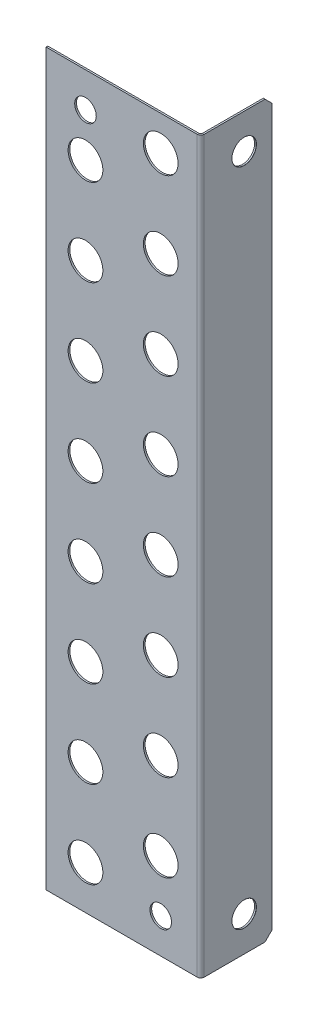
ISO-10303-21;
HEADER;
FILE_DESCRIPTION(('STEP AP214'),'2;1');
FILE_NAME('part.step','',(''),(''),'','','');
FILE_SCHEMA(('AUTOMOTIVE_DESIGN { 1 0 10303 214 1 1 1 1 }'));
ENDSEC;
DATA;
#1=APPLICATION_CONTEXT('core data for automotive mechanical design processes');
#2=APPLICATION_PROTOCOL_DEFINITION('international standard','automotive_design',2000,#1);
#3=PRODUCT_CONTEXT('',#1,'mechanical');
#4=PRODUCT('Part','Part','',(#3));
#5=PRODUCT_RELATED_PRODUCT_CATEGORY('part','',(#4));
#6=PRODUCT_DEFINITION_FORMATION('','',#4);
#7=PRODUCT_DEFINITION_CONTEXT('part definition',#1,'design');
#8=PRODUCT_DEFINITION('design','',#6,#7);
#9=PRODUCT_DEFINITION_SHAPE('','',#8);
#10=(LENGTH_UNIT() NAMED_UNIT(*) SI_UNIT(.MILLI.,.METRE.));
#11=(NAMED_UNIT(*) PLANE_ANGLE_UNIT() SI_UNIT($,.RADIAN.));
#12=(NAMED_UNIT(*) SI_UNIT($,.STERADIAN.) SOLID_ANGLE_UNIT());
#13=UNCERTAINTY_MEASURE_WITH_UNIT(LENGTH_MEASURE(1.E-05),#10,'distance_accuracy_value','');
#14=(GEOMETRIC_REPRESENTATION_CONTEXT(3) GLOBAL_UNCERTAINTY_ASSIGNED_CONTEXT((#13)) GLOBAL_UNIT_ASSIGNED_CONTEXT((#10,
#11,#12)) REPRESENTATION_CONTEXT('',''));
#15=CARTESIAN_POINT('',(0.,0.,0.));
#16=DIRECTION('',(0.,0.,1.));
#17=DIRECTION('',(1.,0.,0.));
#18=AXIS2_PLACEMENT_3D('',#15,#16,#17);
#19=CARTESIAN_POINT('',(-22.,105.,0.5));
#20=DIRECTION('',(0.,-1.,0.));
#21=DIRECTION('',(0.,0.,-1.));
#22=AXIS2_PLACEMENT_3D('',#19,#20,#21);
#23=PLANE('',#22);
#24=DIRECTION('',(0.,0.,1.));
#25=VECTOR('',#24,1.);
#26=CARTESIAN_POINT('',(21.5,105.,0.));
#27=LINE('',#26,#25);
#28=CARTESIAN_POINT('',(21.5,105.,0.));
#29=VERTEX_POINT('',#28);
#30=CARTESIAN_POINT('',(21.5,105.,0.5));
#31=VERTEX_POINT('',#30);
#32=EDGE_CURVE('E178',#29,#31,#27,.T.);
#33=ORIENTED_EDGE('',*,*,#32,.F.);
#34=DIRECTION('',(-1.,0.,0.));
#35=VECTOR('',#34,1.);
#36=CARTESIAN_POINT('',(-22.,105.,0.));
#37=LINE('',#36,#35);
#38=CARTESIAN_POINT('',(-22.,105.,0.));
#39=VERTEX_POINT('',#38);
#40=EDGE_CURVE('E197',#29,#39,#37,.T.);
#41=ORIENTED_EDGE('',*,*,#40,.T.);
#42=DIRECTION('',(0.,0.,-1.));
#43=VECTOR('',#42,1.);
#44=CARTESIAN_POINT('',(-22.,105.,0.5));
#45=LINE('',#44,#43);
#46=CARTESIAN_POINT('',(-22.,105.,0.5));
#47=VERTEX_POINT('',#46);
#48=EDGE_CURVE('E223',#47,#39,#45,.T.);
#49=ORIENTED_EDGE('',*,*,#48,.F.);
#50=DIRECTION('',(-1.,0.,0.));
#51=VECTOR('',#50,1.);
#52=CARTESIAN_POINT('',(-22.,105.,0.5));
#53=LINE('',#52,#51);
#54=EDGE_CURVE('E210',#31,#47,#53,.T.);
#55=ORIENTED_EDGE('',*,*,#54,.F.);
#56=EDGE_LOOP('',(#33,#41,#49,#55));
#57=FACE_BOUND('',#56,.T.);
#58=ADVANCED_FACE('F47',(#57),#23,.F.);
#59=CARTESIAN_POINT('',(-22.,-105.,0.5));
#60=DIRECTION('',(0.,1.,0.));
#61=DIRECTION('',(0.,0.,1.));
#62=AXIS2_PLACEMENT_3D('',#59,#60,#61);
#63=PLANE('',#62);
#64=DIRECTION('',(0.,0.,1.));
#65=VECTOR('',#64,1.);
#66=CARTESIAN_POINT('',(21.5,-105.,0.));
#67=LINE('',#66,#65);
#68=CARTESIAN_POINT('',(21.5,-105.,0.));
#69=VERTEX_POINT('',#68);
#70=CARTESIAN_POINT('',(21.5,-105.,0.499999999999988));
#71=VERTEX_POINT('',#70);
#72=EDGE_CURVE('E171',#69,#71,#67,.T.);
#73=ORIENTED_EDGE('',*,*,#72,.T.);
#74=DIRECTION('',(1.,0.,0.));
#75=VECTOR('',#74,1.);
#76=CARTESIAN_POINT('',(-22.,-105.,0.5));
#77=LINE('',#76,#75);
#78=CARTESIAN_POINT('',(-22.,-105.,0.5));
#79=VERTEX_POINT('',#78);
#80=EDGE_CURVE('E215',#79,#71,#77,.T.);
#81=ORIENTED_EDGE('',*,*,#80,.F.);
#82=DIRECTION('',(0.,0.,-1.));
#83=VECTOR('',#82,1.);
#84=CARTESIAN_POINT('',(-22.,-105.,0.5));
#85=LINE('',#84,#83);
#86=CARTESIAN_POINT('',(-22.,-105.,0.));
#87=VERTEX_POINT('',#86);
#88=EDGE_CURVE('E213',#79,#87,#85,.T.);
#89=ORIENTED_EDGE('',*,*,#88,.T.);
#90=DIRECTION('',(1.,0.,0.));
#91=VECTOR('',#90,1.);
#92=CARTESIAN_POINT('',(-22.,-105.,0.));
#93=LINE('',#92,#91);
#94=EDGE_CURVE('E208',#87,#69,#93,.T.);
#95=ORIENTED_EDGE('',*,*,#94,.T.);
#96=EDGE_LOOP('',(#73,#81,#89,#95));
#97=FACE_BOUND('',#96,.T.);
#98=ADVANCED_FACE('F378',(#97),#63,.F.);
#99=CARTESIAN_POINT('',(0.,0.,0.5));
#100=DIRECTION('',(0.,0.,1.));
#101=DIRECTION('',(1.,0.,0.));
#102=AXIS2_PLACEMENT_3D('',#99,#100,#101);
#103=PLANE('',#102);
#104=CARTESIAN_POINT('',(-10.6506350946109,95.,0.5));
#105=DIRECTION('',(0.,0.,1.));
#106=DIRECTION('',(1.,0.,0.));
#107=AXIS2_PLACEMENT_3D('',#104,#105,#106);
#108=CIRCLE('',#107,3.1);
#109=CARTESIAN_POINT('',(-7.55063509461094,95.,0.5));
#110=VERTEX_POINT('',#109);
#111=EDGE_CURVE('E352',#110,#110,#108,.F.);
#112=ORIENTED_EDGE('',*,*,#111,.T.);
#113=EDGE_LOOP('',(#112));
#114=FACE_BOUND('',#113,.T.);
#115=CARTESIAN_POINT('',(11.,-95.,0.5));
#116=DIRECTION('',(0.,0.,1.));
#117=DIRECTION('',(1.,0.,0.));
#118=AXIS2_PLACEMENT_3D('',#115,#116,#117);
#119=CIRCLE('',#118,3.1);
#120=CARTESIAN_POINT('',(14.1,-95.,0.5));
#121=VERTEX_POINT('',#120);
#122=EDGE_CURVE('E354',#121,#121,#119,.F.);
#123=ORIENTED_EDGE('',*,*,#122,.T.);
#124=EDGE_LOOP('',(#123));
#125=FACE_BOUND('',#124,.T.);
#126=CARTESIAN_POINT('',(-10.6506350946109,57.5,0.5));
#127=DIRECTION('',(0.,0.,1.));
#128=DIRECTION('',(1.,0.,0.));
#129=AXIS2_PLACEMENT_3D('',#126,#127,#128);
#130=CIRCLE('',#129,5.00000000000001);
#131=CARTESIAN_POINT('',(-5.65063509461094,57.5,0.5));
#132=VERTEX_POINT('',#131);
#133=EDGE_CURVE('E184',#132,#132,#130,.T.);
#134=ORIENTED_EDGE('',*,*,#133,.F.);
#135=EDGE_LOOP('',(#134));
#136=FACE_BOUND('',#135,.T.);
#137=CARTESIAN_POINT('',(11.,70.,0.5));
#138=DIRECTION('',(0.,0.,1.));
#139=DIRECTION('',(1.,0.,0.));
#140=AXIS2_PLACEMENT_3D('',#137,#138,#139);
#141=CIRCLE('',#140,5.);
#142=CARTESIAN_POINT('',(16.,70.,0.5));
#143=VERTEX_POINT('',#142);
#144=EDGE_CURVE('E192',#143,#143,#141,.T.);
#145=ORIENTED_EDGE('',*,*,#144,.F.);
#146=EDGE_LOOP('',(#145));
#147=FACE_BOUND('',#146,.T.);
#148=CARTESIAN_POINT('',(11.,95.,0.5));
#149=DIRECTION('',(0.,0.,1.));
#150=DIRECTION('',(1.,0.,0.));
#151=AXIS2_PLACEMENT_3D('',#148,#149,#150);
#152=CIRCLE('',#151,5.);
#153=CARTESIAN_POINT('',(16.,95.,0.5));
#154=VERTEX_POINT('',#153);
#155=EDGE_CURVE('E200',#154,#154,#152,.T.);
#156=ORIENTED_EDGE('',*,*,#155,.F.);
#157=EDGE_LOOP('',(#156));
#158=FACE_BOUND('',#157,.T.);
#159=CARTESIAN_POINT('',(-10.6506350946109,82.5,0.5));
#160=DIRECTION('',(0.,0.,1.));
#161=DIRECTION('',(1.,0.,0.));
#162=AXIS2_PLACEMENT_3D('',#159,#160,#161);
#163=CIRCLE('',#162,5.00000000000001);
#164=CARTESIAN_POINT('',(-5.65063509461094,82.5,0.5));
#165=VERTEX_POINT('',#164);
#166=EDGE_CURVE('E191',#165,#165,#163,.T.);
#167=ORIENTED_EDGE('',*,*,#166,.F.);
#168=EDGE_LOOP('',(#167));
#169=FACE_BOUND('',#168,.T.);
#170=CARTESIAN_POINT('',(11.,45.,0.5));
#171=DIRECTION('',(0.,0.,1.));
#172=DIRECTION('',(1.,0.,0.));
#173=AXIS2_PLACEMENT_3D('',#170,#171,#172);
#174=CIRCLE('',#173,5.);
#175=CARTESIAN_POINT('',(16.,45.,0.5));
#176=VERTEX_POINT('',#175);
#177=EDGE_CURVE('E230',#176,#176,#174,.T.);
#178=ORIENTED_EDGE('',*,*,#177,.F.);
#179=EDGE_LOOP('',(#178));
#180=FACE_BOUND('',#179,.T.);
#181=CARTESIAN_POINT('',(11.,20.,0.5));
#182=DIRECTION('',(0.,0.,1.));
#183=DIRECTION('',(1.,0.,0.));
#184=AXIS2_PLACEMENT_3D('',#181,#182,#183);
#185=CIRCLE('',#184,5.);
#186=CARTESIAN_POINT('',(16.,20.,0.5));
#187=VERTEX_POINT('',#186);
#188=EDGE_CURVE('E232',#187,#187,#185,.T.);
#189=ORIENTED_EDGE('',*,*,#188,.F.);
#190=EDGE_LOOP('',(#189));
#191=FACE_BOUND('',#190,.T.);
#192=CARTESIAN_POINT('',(11.,-5.00000000000003,0.5));
#193=DIRECTION('',(0.,0.,1.));
#194=DIRECTION('',(1.,0.,0.));
#195=AXIS2_PLACEMENT_3D('',#192,#193,#194);
#196=CIRCLE('',#195,5.);
#197=CARTESIAN_POINT('',(16.,-5.00000000000003,0.5));
#198=VERTEX_POINT('',#197);
#199=EDGE_CURVE('E241',#198,#198,#196,.T.);
#200=ORIENTED_EDGE('',*,*,#199,.F.);
#201=EDGE_LOOP('',(#200));
#202=FACE_BOUND('',#201,.T.);
#203=CARTESIAN_POINT('',(11.,-30.,0.5));
#204=DIRECTION('',(0.,0.,1.));
#205=DIRECTION('',(1.,0.,0.));
#206=AXIS2_PLACEMENT_3D('',#203,#204,#205);
#207=CIRCLE('',#206,5.);
#208=CARTESIAN_POINT('',(16.,-30.,0.5));
#209=VERTEX_POINT('',#208);
#210=EDGE_CURVE('E250',#209,#209,#207,.T.);
#211=ORIENTED_EDGE('',*,*,#210,.F.);
#212=EDGE_LOOP('',(#211));
#213=FACE_BOUND('',#212,.T.);
#214=CARTESIAN_POINT('',(11.,-55.,0.5));
#215=DIRECTION('',(0.,0.,1.));
#216=DIRECTION('',(1.,0.,0.));
#217=AXIS2_PLACEMENT_3D('',#214,#215,#216);
#218=CIRCLE('',#217,5.);
#219=CARTESIAN_POINT('',(16.,-55.,0.5));
#220=VERTEX_POINT('',#219);
#221=EDGE_CURVE('E254',#220,#220,#218,.T.);
#222=ORIENTED_EDGE('',*,*,#221,.F.);
#223=EDGE_LOOP('',(#222));
#224=FACE_BOUND('',#223,.T.);
#225=CARTESIAN_POINT('',(11.,-80.,0.5));
#226=DIRECTION('',(0.,0.,1.));
#227=DIRECTION('',(1.,0.,0.));
#228=AXIS2_PLACEMENT_3D('',#225,#226,#227);
#229=CIRCLE('',#228,5.);
#230=CARTESIAN_POINT('',(16.,-80.,0.5));
#231=VERTEX_POINT('',#230);
#232=EDGE_CURVE('E256',#231,#231,#229,.T.);
#233=ORIENTED_EDGE('',*,*,#232,.F.);
#234=EDGE_LOOP('',(#233));
#235=FACE_BOUND('',#234,.T.);
#236=CARTESIAN_POINT('',(-10.6506350946109,32.5,0.5));
#237=DIRECTION('',(0.,0.,1.));
#238=DIRECTION('',(1.,0.,0.));
#239=AXIS2_PLACEMENT_3D('',#236,#237,#238);
#240=CIRCLE('',#239,5.00000000000001);
#241=CARTESIAN_POINT('',(-5.65063509461093,32.5,0.5));
#242=VERTEX_POINT('',#241);
#243=EDGE_CURVE('E261',#242,#242,#240,.T.);
#244=ORIENTED_EDGE('',*,*,#243,.F.);
#245=EDGE_LOOP('',(#244));
#246=FACE_BOUND('',#245,.T.);
#247=CARTESIAN_POINT('',(-10.6506350946109,7.49999999999997,0.5));
#248=DIRECTION('',(0.,0.,1.));
#249=DIRECTION('',(1.,0.,0.));
#250=AXIS2_PLACEMENT_3D('',#247,#248,#249);
#251=CIRCLE('',#250,5.00000000000001);
#252=CARTESIAN_POINT('',(-5.65063509461093,7.49999999999997,0.5));
#253=VERTEX_POINT('',#252);
#254=EDGE_CURVE('E272',#253,#253,#251,.T.);
#255=ORIENTED_EDGE('',*,*,#254,.F.);
#256=EDGE_LOOP('',(#255));
#257=FACE_BOUND('',#256,.T.);
#258=CARTESIAN_POINT('',(-10.6506350946109,-17.5,0.5));
#259=DIRECTION('',(0.,0.,1.));
#260=DIRECTION('',(1.,0.,0.));
#261=AXIS2_PLACEMENT_3D('',#258,#259,#260);
#262=CIRCLE('',#261,5.00000000000001);
#263=CARTESIAN_POINT('',(-5.65063509461093,-17.5,0.5));
#264=VERTEX_POINT('',#263);
#265=EDGE_CURVE('E280',#264,#264,#262,.T.);
#266=ORIENTED_EDGE('',*,*,#265,.F.);
#267=EDGE_LOOP('',(#266));
#268=FACE_BOUND('',#267,.T.);
#269=CARTESIAN_POINT('',(-10.6506350946109,-42.5,0.5));
#270=DIRECTION('',(0.,0.,1.));
#271=DIRECTION('',(1.,0.,0.));
#272=AXIS2_PLACEMENT_3D('',#269,#270,#271);
#273=CIRCLE('',#272,5.00000000000001);
#274=CARTESIAN_POINT('',(-5.65063509461093,-42.5,0.5));
#275=VERTEX_POINT('',#274);
#276=EDGE_CURVE('E282',#275,#275,#273,.T.);
#277=ORIENTED_EDGE('',*,*,#276,.F.);
#278=EDGE_LOOP('',(#277));
#279=FACE_BOUND('',#278,.T.);
#280=CARTESIAN_POINT('',(-10.6506350946109,-67.5000000000001,0.5));
#281=DIRECTION('',(0.,0.,1.));
#282=DIRECTION('',(1.,0.,0.));
#283=AXIS2_PLACEMENT_3D('',#280,#281,#282);
#284=CIRCLE('',#283,5.00000000000001);
#285=CARTESIAN_POINT('',(-5.65063509461092,-67.5000000000001,0.5));
#286=VERTEX_POINT('',#285);
#287=EDGE_CURVE('E289',#286,#286,#284,.T.);
#288=ORIENTED_EDGE('',*,*,#287,.F.);
#289=EDGE_LOOP('',(#288));
#290=FACE_BOUND('',#289,.T.);
#291=CARTESIAN_POINT('',(-10.6506350946109,-92.5000000000001,0.5));
#292=DIRECTION('',(0.,0.,1.));
#293=DIRECTION('',(1.,0.,0.));
#294=AXIS2_PLACEMENT_3D('',#291,#292,#293);
#295=CIRCLE('',#294,5.00000000000001);
#296=CARTESIAN_POINT('',(-5.65063509461092,-92.5000000000001,0.5));
#297=VERTEX_POINT('',#296);
#298=EDGE_CURVE('E294',#297,#297,#295,.T.);
#299=ORIENTED_EDGE('',*,*,#298,.F.);
#300=EDGE_LOOP('',(#299));
#301=FACE_BOUND('',#300,.T.);
#302=ORIENTED_EDGE('',*,*,#80,.T.);
#303=DIRECTION('',(0.,-1.,0.));
#304=VECTOR('',#303,1.);
#305=CARTESIAN_POINT('',(21.5,-105.,0.499999999999988));
#306=LINE('',#305,#304);
#307=EDGE_CURVE('E142',#71,#31,#306,.F.);
#308=ORIENTED_EDGE('',*,*,#307,.T.);
#309=ORIENTED_EDGE('',*,*,#54,.T.);
#310=DIRECTION('',(0.,-1.,0.));
#311=VECTOR('',#310,1.);
#312=CARTESIAN_POINT('',(-22.,105.,0.5));
#313=LINE('',#312,#311);
#314=EDGE_CURVE('E209',#47,#79,#313,.T.);
#315=ORIENTED_EDGE('',*,*,#314,.T.);
#316=EDGE_LOOP('',(#302,#308,#309,#315));
#317=FACE_BOUND('',#316,.T.);
#318=ADVANCED_FACE('F383',(#114,#125,#136,#147,#158,#169,#180,#191,#202,#213,#224,#235,#246,
#257,#268,#279,#290,#301,#317),#103,.T.);
#319=CARTESIAN_POINT('',(0.,0.,0.));
#320=DIRECTION('',(0.,0.,1.));
#321=DIRECTION('',(1.,0.,0.));
#322=AXIS2_PLACEMENT_3D('',#319,#320,#321);
#323=PLANE('',#322);
#324=CARTESIAN_POINT('',(-10.6506350946109,95.,0.));
#325=DIRECTION('',(0.,0.,1.));
#326=DIRECTION('',(1.,0.,0.));
#327=AXIS2_PLACEMENT_3D('',#324,#325,#326);
#328=CIRCLE('',#327,3.1);
#329=CARTESIAN_POINT('',(-7.55063509461094,95.,0.));
#330=VERTEX_POINT('',#329);
#331=EDGE_CURVE('E357',#330,#330,#328,.T.);
#332=ORIENTED_EDGE('',*,*,#331,.T.);
#333=EDGE_LOOP('',(#332));
#334=FACE_BOUND('',#333,.T.);
#335=CARTESIAN_POINT('',(11.,-95.,0.));
#336=DIRECTION('',(0.,0.,1.));
#337=DIRECTION('',(1.,0.,0.));
#338=AXIS2_PLACEMENT_3D('',#335,#336,#337);
#339=CIRCLE('',#338,3.1);
#340=CARTESIAN_POINT('',(14.1,-95.,0.));
#341=VERTEX_POINT('',#340);
#342=EDGE_CURVE('E356',#341,#341,#339,.T.);
#343=ORIENTED_EDGE('',*,*,#342,.T.);
#344=EDGE_LOOP('',(#343));
#345=FACE_BOUND('',#344,.T.);
#346=CARTESIAN_POINT('',(-10.6506350946109,-92.5000000000001,0.));
#347=DIRECTION('',(0.,0.,1.));
#348=DIRECTION('',(1.,0.,0.));
#349=AXIS2_PLACEMENT_3D('',#346,#347,#348);
#350=CIRCLE('',#349,5.00000000000001);
#351=CARTESIAN_POINT('',(-5.65063509461092,-92.5000000000001,0.));
#352=VERTEX_POINT('',#351);
#353=EDGE_CURVE('E292',#352,#352,#350,.T.);
#354=ORIENTED_EDGE('',*,*,#353,.T.);
#355=EDGE_LOOP('',(#354));
#356=FACE_BOUND('',#355,.T.);
#357=CARTESIAN_POINT('',(-10.6506350946109,-67.5000000000001,0.));
#358=DIRECTION('',(0.,0.,1.));
#359=DIRECTION('',(1.,0.,0.));
#360=AXIS2_PLACEMENT_3D('',#357,#358,#359);
#361=CIRCLE('',#360,5.00000000000001);
#362=CARTESIAN_POINT('',(-5.65063509461092,-67.5000000000001,0.));
#363=VERTEX_POINT('',#362);
#364=EDGE_CURVE('E287',#363,#363,#361,.T.);
#365=ORIENTED_EDGE('',*,*,#364,.T.);
#366=EDGE_LOOP('',(#365));
#367=FACE_BOUND('',#366,.T.);
#368=CARTESIAN_POINT('',(-10.6506350946109,-42.5,0.));
#369=DIRECTION('',(0.,0.,1.));
#370=DIRECTION('',(1.,0.,0.));
#371=AXIS2_PLACEMENT_3D('',#368,#369,#370);
#372=CIRCLE('',#371,5.00000000000001);
#373=CARTESIAN_POINT('',(-5.65063509461093,-42.5,0.));
#374=VERTEX_POINT('',#373);
#375=EDGE_CURVE('E278',#374,#374,#372,.T.);
#376=ORIENTED_EDGE('',*,*,#375,.T.);
#377=EDGE_LOOP('',(#376));
#378=FACE_BOUND('',#377,.T.);
#379=CARTESIAN_POINT('',(-10.6506350946109,-17.5,0.));
#380=DIRECTION('',(0.,0.,1.));
#381=DIRECTION('',(1.,0.,0.));
#382=AXIS2_PLACEMENT_3D('',#379,#380,#381);
#383=CIRCLE('',#382,5.00000000000001);
#384=CARTESIAN_POINT('',(-5.65063509461093,-17.5,0.));
#385=VERTEX_POINT('',#384);
#386=EDGE_CURVE('E274',#385,#385,#383,.T.);
#387=ORIENTED_EDGE('',*,*,#386,.T.);
#388=EDGE_LOOP('',(#387));
#389=FACE_BOUND('',#388,.T.);
#390=CARTESIAN_POINT('',(-10.6506350946109,7.49999999999997,0.));
#391=DIRECTION('',(0.,0.,1.));
#392=DIRECTION('',(1.,0.,0.));
#393=AXIS2_PLACEMENT_3D('',#390,#391,#392);
#394=CIRCLE('',#393,5.00000000000001);
#395=CARTESIAN_POINT('',(-5.65063509461093,7.49999999999997,0.));
#396=VERTEX_POINT('',#395);
#397=EDGE_CURVE('E266',#396,#396,#394,.T.);
#398=ORIENTED_EDGE('',*,*,#397,.T.);
#399=EDGE_LOOP('',(#398));
#400=FACE_BOUND('',#399,.T.);
#401=CARTESIAN_POINT('',(-10.6506350946109,32.5,0.));
#402=DIRECTION('',(0.,0.,1.));
#403=DIRECTION('',(1.,0.,0.));
#404=AXIS2_PLACEMENT_3D('',#401,#402,#403);
#405=CIRCLE('',#404,5.00000000000001);
#406=CARTESIAN_POINT('',(-5.65063509461093,32.5,0.));
#407=VERTEX_POINT('',#406);
#408=EDGE_CURVE('E264',#407,#407,#405,.T.);
#409=ORIENTED_EDGE('',*,*,#408,.T.);
#410=EDGE_LOOP('',(#409));
#411=FACE_BOUND('',#410,.T.);
#412=CARTESIAN_POINT('',(11.,-80.,0.));
#413=DIRECTION('',(0.,0.,1.));
#414=DIRECTION('',(1.,0.,0.));
#415=AXIS2_PLACEMENT_3D('',#412,#413,#414);
#416=CIRCLE('',#415,5.);
#417=CARTESIAN_POINT('',(16.,-80.,0.));
#418=VERTEX_POINT('',#417);
#419=EDGE_CURVE('E257',#418,#418,#416,.T.);
#420=ORIENTED_EDGE('',*,*,#419,.T.);
#421=EDGE_LOOP('',(#420));
#422=FACE_BOUND('',#421,.T.);
#423=CARTESIAN_POINT('',(11.,-55.,0.));
#424=DIRECTION('',(0.,0.,1.));
#425=DIRECTION('',(1.,0.,0.));
#426=AXIS2_PLACEMENT_3D('',#423,#424,#425);
#427=CIRCLE('',#426,5.);
#428=CARTESIAN_POINT('',(16.,-55.,0.));
#429=VERTEX_POINT('',#428);
#430=EDGE_CURVE('E249',#429,#429,#427,.T.);
#431=ORIENTED_EDGE('',*,*,#430,.T.);
#432=EDGE_LOOP('',(#431));
#433=FACE_BOUND('',#432,.T.);
#434=CARTESIAN_POINT('',(11.,-30.,0.));
#435=DIRECTION('',(0.,0.,1.));
#436=DIRECTION('',(1.,0.,0.));
#437=AXIS2_PLACEMENT_3D('',#434,#435,#436);
#438=CIRCLE('',#437,5.);
#439=CARTESIAN_POINT('',(16.,-30.,0.));
#440=VERTEX_POINT('',#439);
#441=EDGE_CURVE('E242',#440,#440,#438,.T.);
#442=ORIENTED_EDGE('',*,*,#441,.T.);
#443=EDGE_LOOP('',(#442));
#444=FACE_BOUND('',#443,.T.);
#445=CARTESIAN_POINT('',(11.,-5.00000000000003,0.));
#446=DIRECTION('',(0.,0.,1.));
#447=DIRECTION('',(1.,0.,0.));
#448=AXIS2_PLACEMENT_3D('',#445,#446,#447);
#449=CIRCLE('',#448,5.);
#450=CARTESIAN_POINT('',(16.,-5.00000000000003,0.));
#451=VERTEX_POINT('',#450);
#452=EDGE_CURVE('E238',#451,#451,#449,.T.);
#453=ORIENTED_EDGE('',*,*,#452,.T.);
#454=EDGE_LOOP('',(#453));
#455=FACE_BOUND('',#454,.T.);
#456=CARTESIAN_POINT('',(11.,20.,0.));
#457=DIRECTION('',(0.,0.,1.));
#458=DIRECTION('',(1.,0.,0.));
#459=AXIS2_PLACEMENT_3D('',#456,#457,#458);
#460=CIRCLE('',#459,5.);
#461=CARTESIAN_POINT('',(16.,20.,0.));
#462=VERTEX_POINT('',#461);
#463=EDGE_CURVE('E235',#462,#462,#460,.T.);
#464=ORIENTED_EDGE('',*,*,#463,.T.);
#465=EDGE_LOOP('',(#464));
#466=FACE_BOUND('',#465,.T.);
#467=CARTESIAN_POINT('',(11.,45.,0.));
#468=DIRECTION('',(0.,0.,1.));
#469=DIRECTION('',(1.,0.,0.));
#470=AXIS2_PLACEMENT_3D('',#467,#468,#469);
#471=CIRCLE('',#470,5.);
#472=CARTESIAN_POINT('',(16.,45.,0.));
#473=VERTEX_POINT('',#472);
#474=EDGE_CURVE('E228',#473,#473,#471,.T.);
#475=ORIENTED_EDGE('',*,*,#474,.T.);
#476=EDGE_LOOP('',(#475));
#477=FACE_BOUND('',#476,.T.);
#478=CARTESIAN_POINT('',(-10.6506350946109,82.5,0.));
#479=DIRECTION('',(0.,0.,1.));
#480=DIRECTION('',(1.,0.,0.));
#481=AXIS2_PLACEMENT_3D('',#478,#479,#480);
#482=CIRCLE('',#481,5.00000000000001);
#483=CARTESIAN_POINT('',(-5.65063509461094,82.5,0.));
#484=VERTEX_POINT('',#483);
#485=EDGE_CURVE('E205',#484,#484,#482,.T.);
#486=ORIENTED_EDGE('',*,*,#485,.T.);
#487=EDGE_LOOP('',(#486));
#488=FACE_BOUND('',#487,.T.);
#489=CARTESIAN_POINT('',(11.,95.,0.));
#490=DIRECTION('',(0.,0.,1.));
#491=DIRECTION('',(1.,0.,0.));
#492=AXIS2_PLACEMENT_3D('',#489,#490,#491);
#493=CIRCLE('',#492,5.);
#494=CARTESIAN_POINT('',(16.,95.,0.));
#495=VERTEX_POINT('',#494);
#496=EDGE_CURVE('E193',#495,#495,#493,.T.);
#497=ORIENTED_EDGE('',*,*,#496,.T.);
#498=EDGE_LOOP('',(#497));
#499=FACE_BOUND('',#498,.T.);
#500=CARTESIAN_POINT('',(11.,70.,0.));
#501=DIRECTION('',(0.,0.,1.));
#502=DIRECTION('',(1.,0.,0.));
#503=AXIS2_PLACEMENT_3D('',#500,#501,#502);
#504=CIRCLE('',#503,5.);
#505=CARTESIAN_POINT('',(16.,70.,0.));
#506=VERTEX_POINT('',#505);
#507=EDGE_CURVE('E189',#506,#506,#504,.T.);
#508=ORIENTED_EDGE('',*,*,#507,.T.);
#509=EDGE_LOOP('',(#508));
#510=FACE_BOUND('',#509,.T.);
#511=CARTESIAN_POINT('',(-10.6506350946109,57.5,0.));
#512=DIRECTION('',(0.,0.,1.));
#513=DIRECTION('',(1.,0.,0.));
#514=AXIS2_PLACEMENT_3D('',#511,#512,#513);
#515=CIRCLE('',#514,5.00000000000001);
#516=CARTESIAN_POINT('',(-5.65063509461094,57.5,0.));
#517=VERTEX_POINT('',#516);
#518=EDGE_CURVE('E181',#517,#517,#515,.T.);
#519=ORIENTED_EDGE('',*,*,#518,.T.);
#520=EDGE_LOOP('',(#519));
#521=FACE_BOUND('',#520,.T.);
#522=DIRECTION('',(0.,-1.,0.));
#523=VECTOR('',#522,1.);
#524=CARTESIAN_POINT('',(21.5,-105.,0.));
#525=LINE('',#524,#523);
#526=EDGE_CURVE('E174',#69,#29,#525,.F.);
#527=ORIENTED_EDGE('',*,*,#526,.F.);
#528=ORIENTED_EDGE('',*,*,#94,.F.);
#529=DIRECTION('',(0.,-1.,0.));
#530=VECTOR('',#529,1.);
#531=CARTESIAN_POINT('',(-22.,105.,0.));
#532=LINE('',#531,#530);
#533=EDGE_CURVE('E220',#39,#87,#532,.T.);
#534=ORIENTED_EDGE('',*,*,#533,.F.);
#535=ORIENTED_EDGE('',*,*,#40,.F.);
#536=EDGE_LOOP('',(#527,#528,#534,#535));
#537=FACE_BOUND('',#536,.T.);
#538=ADVANCED_FACE('F364',(#334,#345,#356,#367,#378,#389,#400,#411,#422,#433,#444,#455,#466,
#477,#488,#499,#510,#521,#537),#323,.F.);
#539=CARTESIAN_POINT('',(-10.6506350946109,-92.5000000000001,0.));
#540=DIRECTION('',(0.,0.,1.));
#541=DIRECTION('',(1.,0.,0.));
#542=AXIS2_PLACEMENT_3D('',#539,#540,#541);
#543=CYLINDRICAL_SURFACE('',#542,5.00000000000001);
#544=ORIENTED_EDGE('',*,*,#353,.F.);
#545=EDGE_LOOP('',(#544));
#546=FACE_BOUND('',#545,.T.);
#547=ORIENTED_EDGE('',*,*,#298,.T.);
#548=EDGE_LOOP('',(#547));
#549=FACE_BOUND('',#548,.T.);
#550=ADVANCED_FACE('F434',(#546,#549),#543,.F.);
#551=CARTESIAN_POINT('',(-10.6506350946109,-67.5000000000001,0.));
#552=DIRECTION('',(0.,0.,1.));
#553=DIRECTION('',(1.,0.,0.));
#554=AXIS2_PLACEMENT_3D('',#551,#552,#553);
#555=CYLINDRICAL_SURFACE('',#554,5.00000000000001);
#556=ORIENTED_EDGE('',*,*,#364,.F.);
#557=EDGE_LOOP('',(#556));
#558=FACE_BOUND('',#557,.T.);
#559=ORIENTED_EDGE('',*,*,#287,.T.);
#560=EDGE_LOOP('',(#559));
#561=FACE_BOUND('',#560,.T.);
#562=ADVANCED_FACE('F431',(#558,#561),#555,.F.);
#563=CARTESIAN_POINT('',(-10.6506350946109,-42.5,0.));
#564=DIRECTION('',(0.,0.,1.));
#565=DIRECTION('',(1.,0.,0.));
#566=AXIS2_PLACEMENT_3D('',#563,#564,#565);
#567=CYLINDRICAL_SURFACE('',#566,5.00000000000001);
#568=ORIENTED_EDGE('',*,*,#375,.F.);
#569=EDGE_LOOP('',(#568));
#570=FACE_BOUND('',#569,.T.);
#571=ORIENTED_EDGE('',*,*,#276,.T.);
#572=EDGE_LOOP('',(#571));
#573=FACE_BOUND('',#572,.T.);
#574=ADVANCED_FACE('F430',(#570,#573),#567,.F.);
#575=CARTESIAN_POINT('',(-10.6506350946109,-17.5,0.));
#576=DIRECTION('',(0.,0.,1.));
#577=DIRECTION('',(1.,0.,0.));
#578=AXIS2_PLACEMENT_3D('',#575,#576,#577);
#579=CYLINDRICAL_SURFACE('',#578,5.00000000000001);
#580=ORIENTED_EDGE('',*,*,#386,.F.);
#581=EDGE_LOOP('',(#580));
#582=FACE_BOUND('',#581,.T.);
#583=ORIENTED_EDGE('',*,*,#265,.T.);
#584=EDGE_LOOP('',(#583));
#585=FACE_BOUND('',#584,.T.);
#586=ADVANCED_FACE('F421',(#582,#585),#579,.F.);
#587=CARTESIAN_POINT('',(-10.6506350946109,7.49999999999997,0.));
#588=DIRECTION('',(0.,0.,1.));
#589=DIRECTION('',(1.,0.,0.));
#590=AXIS2_PLACEMENT_3D('',#587,#588,#589);
#591=CYLINDRICAL_SURFACE('',#590,5.00000000000001);
#592=ORIENTED_EDGE('',*,*,#397,.F.);
#593=EDGE_LOOP('',(#592));
#594=FACE_BOUND('',#593,.T.);
#595=ORIENTED_EDGE('',*,*,#254,.T.);
#596=EDGE_LOOP('',(#595));
#597=FACE_BOUND('',#596,.T.);
#598=ADVANCED_FACE('F419',(#594,#597),#591,.F.);
#599=CARTESIAN_POINT('',(-10.6506350946109,32.5,0.));
#600=DIRECTION('',(0.,0.,1.));
#601=DIRECTION('',(1.,0.,0.));
#602=AXIS2_PLACEMENT_3D('',#599,#600,#601);
#603=CYLINDRICAL_SURFACE('',#602,5.00000000000001);
#604=ORIENTED_EDGE('',*,*,#408,.F.);
#605=EDGE_LOOP('',(#604));
#606=FACE_BOUND('',#605,.T.);
#607=ORIENTED_EDGE('',*,*,#243,.T.);
#608=EDGE_LOOP('',(#607));
#609=FACE_BOUND('',#608,.T.);
#610=ADVANCED_FACE('F414',(#606,#609),#603,.F.);
#611=CARTESIAN_POINT('',(11.,-80.,0.));
#612=DIRECTION('',(0.,0.,1.));
#613=DIRECTION('',(1.,0.,0.));
#614=AXIS2_PLACEMENT_3D('',#611,#612,#613);
#615=CYLINDRICAL_SURFACE('',#614,5.);
#616=ORIENTED_EDGE('',*,*,#419,.F.);
#617=EDGE_LOOP('',(#616));
#618=FACE_BOUND('',#617,.T.);
#619=ORIENTED_EDGE('',*,*,#232,.T.);
#620=EDGE_LOOP('',(#619));
#621=FACE_BOUND('',#620,.T.);
#622=ADVANCED_FACE('F411',(#618,#621),#615,.F.);
#623=CARTESIAN_POINT('',(11.,-55.,0.));
#624=DIRECTION('',(0.,0.,1.));
#625=DIRECTION('',(1.,0.,0.));
#626=AXIS2_PLACEMENT_3D('',#623,#624,#625);
#627=CYLINDRICAL_SURFACE('',#626,5.);
#628=ORIENTED_EDGE('',*,*,#430,.F.);
#629=EDGE_LOOP('',(#628));
#630=FACE_BOUND('',#629,.T.);
#631=ORIENTED_EDGE('',*,*,#221,.T.);
#632=EDGE_LOOP('',(#631));
#633=FACE_BOUND('',#632,.T.);
#634=ADVANCED_FACE('F410',(#630,#633),#627,.F.);
#635=CARTESIAN_POINT('',(11.,-30.,0.));
#636=DIRECTION('',(0.,0.,1.));
#637=DIRECTION('',(1.,0.,0.));
#638=AXIS2_PLACEMENT_3D('',#635,#636,#637);
#639=CYLINDRICAL_SURFACE('',#638,5.);
#640=ORIENTED_EDGE('',*,*,#441,.F.);
#641=EDGE_LOOP('',(#640));
#642=FACE_BOUND('',#641,.T.);
#643=ORIENTED_EDGE('',*,*,#210,.T.);
#644=EDGE_LOOP('',(#643));
#645=FACE_BOUND('',#644,.T.);
#646=ADVANCED_FACE('F401',(#642,#645),#639,.F.);
#647=CARTESIAN_POINT('',(11.,-5.00000000000003,0.));
#648=DIRECTION('',(0.,0.,1.));
#649=DIRECTION('',(1.,0.,0.));
#650=AXIS2_PLACEMENT_3D('',#647,#648,#649);
#651=CYLINDRICAL_SURFACE('',#650,5.);
#652=ORIENTED_EDGE('',*,*,#452,.F.);
#653=EDGE_LOOP('',(#652));
#654=FACE_BOUND('',#653,.T.);
#655=ORIENTED_EDGE('',*,*,#199,.T.);
#656=EDGE_LOOP('',(#655));
#657=FACE_BOUND('',#656,.T.);
#658=ADVANCED_FACE('F397',(#654,#657),#651,.F.);
#659=CARTESIAN_POINT('',(11.,20.,0.));
#660=DIRECTION('',(0.,0.,1.));
#661=DIRECTION('',(1.,0.,0.));
#662=AXIS2_PLACEMENT_3D('',#659,#660,#661);
#663=CYLINDRICAL_SURFACE('',#662,5.);
#664=ORIENTED_EDGE('',*,*,#463,.F.);
#665=EDGE_LOOP('',(#664));
#666=FACE_BOUND('',#665,.T.);
#667=ORIENTED_EDGE('',*,*,#188,.T.);
#668=EDGE_LOOP('',(#667));
#669=FACE_BOUND('',#668,.T.);
#670=ADVANCED_FACE('F391',(#666,#669),#663,.F.);
#671=CARTESIAN_POINT('',(11.,45.,0.));
#672=DIRECTION('',(0.,0.,1.));
#673=DIRECTION('',(1.,0.,0.));
#674=AXIS2_PLACEMENT_3D('',#671,#672,#673);
#675=CYLINDRICAL_SURFACE('',#674,5.);
#676=ORIENTED_EDGE('',*,*,#474,.F.);
#677=EDGE_LOOP('',(#676));
#678=FACE_BOUND('',#677,.T.);
#679=ORIENTED_EDGE('',*,*,#177,.T.);
#680=EDGE_LOOP('',(#679));
#681=FACE_BOUND('',#680,.T.);
#682=ADVANCED_FACE('F394',(#678,#681),#675,.F.);
#683=CARTESIAN_POINT('',(-22.,105.,0.5));
#684=DIRECTION('',(1.,0.,0.));
#685=DIRECTION('',(0.,1.,0.));
#686=AXIS2_PLACEMENT_3D('',#683,#684,#685);
#687=PLANE('',#686);
#688=ORIENTED_EDGE('',*,*,#533,.T.);
#689=ORIENTED_EDGE('',*,*,#88,.F.);
#690=ORIENTED_EDGE('',*,*,#314,.F.);
#691=ORIENTED_EDGE('',*,*,#48,.T.);
#692=EDGE_LOOP('',(#688,#689,#690,#691));
#693=FACE_BOUND('',#692,.T.);
#694=ADVANCED_FACE('F393',(#693),#687,.F.);
#695=CARTESIAN_POINT('',(-10.6506350946109,82.5,0.));
#696=DIRECTION('',(0.,0.,1.));
#697=DIRECTION('',(1.,0.,0.));
#698=AXIS2_PLACEMENT_3D('',#695,#696,#697);
#699=CYLINDRICAL_SURFACE('',#698,5.00000000000001);
#700=ORIENTED_EDGE('',*,*,#485,.F.);
#701=EDGE_LOOP('',(#700));
#702=FACE_BOUND('',#701,.T.);
#703=ORIENTED_EDGE('',*,*,#166,.T.);
#704=EDGE_LOOP('',(#703));
#705=FACE_BOUND('',#704,.T.);
#706=ADVANCED_FACE('F499',(#702,#705),#699,.F.);
#707=CARTESIAN_POINT('',(11.,95.,0.));
#708=DIRECTION('',(0.,0.,1.));
#709=DIRECTION('',(1.,0.,0.));
#710=AXIS2_PLACEMENT_3D('',#707,#708,#709);
#711=CYLINDRICAL_SURFACE('',#710,5.);
#712=ORIENTED_EDGE('',*,*,#496,.F.);
#713=EDGE_LOOP('',(#712));
#714=FACE_BOUND('',#713,.T.);
#715=ORIENTED_EDGE('',*,*,#155,.T.);
#716=EDGE_LOOP('',(#715));
#717=FACE_BOUND('',#716,.T.);
#718=ADVANCED_FACE('F496',(#714,#717),#711,.F.);
#719=CARTESIAN_POINT('',(11.,70.,0.));
#720=DIRECTION('',(0.,0.,1.));
#721=DIRECTION('',(1.,0.,0.));
#722=AXIS2_PLACEMENT_3D('',#719,#720,#721);
#723=CYLINDRICAL_SURFACE('',#722,5.);
#724=ORIENTED_EDGE('',*,*,#507,.F.);
#725=EDGE_LOOP('',(#724));
#726=FACE_BOUND('',#725,.T.);
#727=ORIENTED_EDGE('',*,*,#144,.T.);
#728=EDGE_LOOP('',(#727));
#729=FACE_BOUND('',#728,.T.);
#730=ADVANCED_FACE('F495',(#726,#729),#723,.F.);
#731=CARTESIAN_POINT('',(-10.6506350946109,57.5,0.));
#732=DIRECTION('',(0.,0.,1.));
#733=DIRECTION('',(1.,0.,0.));
#734=AXIS2_PLACEMENT_3D('',#731,#732,#733);
#735=CYLINDRICAL_SURFACE('',#734,5.00000000000001);
#736=ORIENTED_EDGE('',*,*,#518,.F.);
#737=EDGE_LOOP('',(#736));
#738=FACE_BOUND('',#737,.T.);
#739=ORIENTED_EDGE('',*,*,#133,.T.);
#740=EDGE_LOOP('',(#739));
#741=FACE_BOUND('',#740,.T.);
#742=ADVANCED_FACE('F487',(#738,#741),#735,.F.);
#743=CARTESIAN_POINT('',(21.5,105.,-0.499999999999999));
#744=DIRECTION('',(0.,1.,0.));
#745=DIRECTION('',(0.,0.,1.));
#746=AXIS2_PLACEMENT_3D('',#743,#744,#745);
#747=PLANE('',#746);
#748=DIRECTION('',(1.,0.,0.));
#749=VECTOR('',#748,1.);
#750=CARTESIAN_POINT('',(22.,105.,-0.499999999999997));
#751=LINE('',#750,#749);
#752=CARTESIAN_POINT('',(22.,105.,-0.499999999999997));
#753=VERTEX_POINT('',#752);
#754=CARTESIAN_POINT('',(22.5,105.,-0.499999999999995));
#755=VERTEX_POINT('',#754);
#756=EDGE_CURVE('E162',#753,#755,#751,.T.);
#757=ORIENTED_EDGE('',*,*,#756,.F.);
#758=CARTESIAN_POINT('',(21.5,105.,-0.499999999999999));
#759=DIRECTION('',(0.,-1.,0.));
#760=DIRECTION('',(0.,0.,-1.));
#761=AXIS2_PLACEMENT_3D('',#758,#759,#760);
#762=CIRCLE('',#761,0.499999999999987);
#763=EDGE_CURVE('E144',#29,#753,#762,.F.);
#764=ORIENTED_EDGE('',*,*,#763,.F.);
#765=ORIENTED_EDGE('',*,*,#32,.T.);
#766=CARTESIAN_POINT('',(21.5,105.,-0.499999999999999));
#767=DIRECTION('',(0.,-1.,0.));
#768=DIRECTION('',(0.,0.,-1.));
#769=AXIS2_PLACEMENT_3D('',#766,#767,#768);
#770=CIRCLE('',#769,0.999999999999987);
#771=EDGE_CURVE('E167',#31,#755,#770,.F.);
#772=ORIENTED_EDGE('',*,*,#771,.T.);
#773=EDGE_LOOP('',(#757,#764,#765,#772));
#774=FACE_BOUND('',#773,.T.);
#775=ADVANCED_FACE('F484',(#774),#747,.T.);
#776=CARTESIAN_POINT('',(21.5,-105.,-0.499999999999999));
#777=DIRECTION('',(0.,1.,0.));
#778=DIRECTION('',(0.,0.,1.));
#779=AXIS2_PLACEMENT_3D('',#776,#777,#778);
#780=PLANE('',#779);
#781=CARTESIAN_POINT('',(21.5,-105.,-0.499999999999999));
#782=DIRECTION('',(0.,-1.,0.));
#783=DIRECTION('',(0.,0.,-1.));
#784=AXIS2_PLACEMENT_3D('',#781,#782,#783);
#785=CIRCLE('',#784,0.499999999999987);
#786=CARTESIAN_POINT('',(22.,-105.,-0.499999999999997));
#787=VERTEX_POINT('',#786);
#788=EDGE_CURVE('E133',#787,#69,#785,.T.);
#789=ORIENTED_EDGE('',*,*,#788,.F.);
#790=DIRECTION('',(1.,0.,0.));
#791=VECTOR('',#790,1.);
#792=CARTESIAN_POINT('',(22.,-105.,-0.499999999999997));
#793=LINE('',#792,#791);
#794=CARTESIAN_POINT('',(22.5,-105.,-0.499999999999995));
#795=VERTEX_POINT('',#794);
#796=EDGE_CURVE('E130',#787,#795,#793,.T.);
#797=ORIENTED_EDGE('',*,*,#796,.T.);
#798=CARTESIAN_POINT('',(21.5,-105.,-0.499999999999999));
#799=DIRECTION('',(0.,-1.,0.));
#800=DIRECTION('',(0.,0.,-1.));
#801=AXIS2_PLACEMENT_3D('',#798,#799,#800);
#802=CIRCLE('',#801,0.999999999999987);
#803=EDGE_CURVE('E138',#795,#71,#802,.T.);
#804=ORIENTED_EDGE('',*,*,#803,.T.);
#805=ORIENTED_EDGE('',*,*,#72,.F.);
#806=EDGE_LOOP('',(#789,#797,#804,#805));
#807=FACE_BOUND('',#806,.T.);
#808=ADVANCED_FACE('F150',(#807),#780,.F.);
#809=CARTESIAN_POINT('',(21.5,-105.,-0.499999999999999));
#810=DIRECTION('',(0.,-1.,0.));
#811=DIRECTION('',(1.,0.,0.));
#812=AXIS2_PLACEMENT_3D('',#809,#810,#811);
#813=CYLINDRICAL_SURFACE('',#812,0.999999999999987);
#814=ORIENTED_EDGE('',*,*,#307,.F.);
#815=ORIENTED_EDGE('',*,*,#803,.F.);
#816=DIRECTION('',(0.,-1.,0.));
#817=VECTOR('',#816,1.);
#818=CARTESIAN_POINT('',(22.5,0.,-0.499999999999995));
#819=LINE('',#818,#817);
#820=EDGE_CURVE('E136',#755,#795,#819,.T.);
#821=ORIENTED_EDGE('',*,*,#820,.F.);
#822=ORIENTED_EDGE('',*,*,#771,.F.);
#823=EDGE_LOOP('',(#814,#815,#821,#822));
#824=FACE_BOUND('',#823,.T.);
#825=ADVANCED_FACE('F140',(#824),#813,.T.);
#826=CARTESIAN_POINT('',(21.5,-105.,-0.499999999999999));
#827=DIRECTION('',(0.,-1.,0.));
#828=DIRECTION('',(1.,0.,0.));
#829=AXIS2_PLACEMENT_3D('',#826,#827,#828);
#830=CYLINDRICAL_SURFACE('',#829,0.499999999999987);
#831=ORIENTED_EDGE('',*,*,#526,.T.);
#832=ORIENTED_EDGE('',*,*,#763,.T.);
#833=DIRECTION('',(0.,-1.,0.));
#834=VECTOR('',#833,1.);
#835=CARTESIAN_POINT('',(22.,105.,-0.499999999999997));
#836=LINE('',#835,#834);
#837=EDGE_CURVE('E146',#753,#787,#836,.T.);
#838=ORIENTED_EDGE('',*,*,#837,.T.);
#839=ORIENTED_EDGE('',*,*,#788,.T.);
#840=EDGE_LOOP('',(#831,#832,#838,#839));
#841=FACE_BOUND('',#840,.T.);
#842=ADVANCED_FACE('F473',(#841),#830,.F.);
#843=CARTESIAN_POINT('',(22.5,-105.,0.));
#844=DIRECTION('',(0.,-1.,0.));
#845=DIRECTION('',(1.,0.,0.));
#846=AXIS2_PLACEMENT_3D('',#843,#844,#845);
#847=PLANE('',#846);
#848=DIRECTION('',(0.,0.,1.));
#849=VECTOR('',#848,1.);
#850=CARTESIAN_POINT('',(22.,-105.,0.));
#851=LINE('',#850,#849);
#852=CARTESIAN_POINT('',(22.0000000000001,-105.,-18.));
#853=VERTEX_POINT('',#852);
#854=EDGE_CURVE('E165',#853,#787,#851,.T.);
#855=ORIENTED_EDGE('',*,*,#854,.F.);
#856=DIRECTION('',(1.,0.,0.));
#857=VECTOR('',#856,1.);
#858=CARTESIAN_POINT('',(22.5000000000001,-105.,-18.));
#859=LINE('',#858,#857);
#860=CARTESIAN_POINT('',(22.5000000000001,-105.,-18.));
#861=VERTEX_POINT('',#860);
#862=EDGE_CURVE('E59',#853,#861,#859,.T.);
#863=ORIENTED_EDGE('',*,*,#862,.T.);
#864=DIRECTION('',(0.,0.,1.));
#865=VECTOR('',#864,1.);
#866=CARTESIAN_POINT('',(22.5,-105.,0.));
#867=LINE('',#866,#865);
#868=EDGE_CURVE('E124',#861,#795,#867,.T.);
#869=ORIENTED_EDGE('',*,*,#868,.T.);
#870=ORIENTED_EDGE('',*,*,#796,.F.);
#871=EDGE_LOOP('',(#855,#863,#869,#870));
#872=FACE_BOUND('',#871,.T.);
#873=ADVANCED_FACE('F123',(#872),#847,.T.);
#874=CARTESIAN_POINT('',(22.5000000000001,105.,-20.));
#875=DIRECTION('',(0.,1.,0.));
#876=DIRECTION('',(-1.,0.,0.));
#877=AXIS2_PLACEMENT_3D('',#874,#875,#876);
#878=PLANE('',#877);
#879=DIRECTION('',(0.,0.,-1.));
#880=VECTOR('',#879,1.);
#881=CARTESIAN_POINT('',(22.5000000000001,105.,-20.));
#882=LINE('',#881,#880);
#883=CARTESIAN_POINT('',(22.5000000000001,105.,-18.));
#884=VERTEX_POINT('',#883);
#885=EDGE_CURVE('E153',#755,#884,#882,.T.);
#886=ORIENTED_EDGE('',*,*,#885,.T.);
#887=DIRECTION('',(-1.,0.,0.));
#888=VECTOR('',#887,1.);
#889=CARTESIAN_POINT('',(22.5000000000001,105.,-18.));
#890=LINE('',#889,#888);
#891=CARTESIAN_POINT('',(22.0000000000001,105.,-18.));
#892=VERTEX_POINT('',#891);
#893=EDGE_CURVE('E296',#884,#892,#890,.T.);
#894=ORIENTED_EDGE('',*,*,#893,.T.);
#895=DIRECTION('',(0.,0.,-1.));
#896=VECTOR('',#895,1.);
#897=CARTESIAN_POINT('',(22.0000000000001,105.,-20.));
#898=LINE('',#897,#896);
#899=EDGE_CURVE('E154',#753,#892,#898,.T.);
#900=ORIENTED_EDGE('',*,*,#899,.F.);
#901=ORIENTED_EDGE('',*,*,#756,.T.);
#902=EDGE_LOOP('',(#886,#894,#900,#901));
#903=FACE_BOUND('',#902,.T.);
#904=ADVANCED_FACE('F332',(#903),#878,.T.);
#905=CARTESIAN_POINT('',(22.5,0.,0.));
#906=DIRECTION('',(1.,0.,0.));
#907=DIRECTION('',(0.,0.,-1.));
#908=AXIS2_PLACEMENT_3D('',#905,#906,#907);
#909=PLANE('',#908);
#910=CARTESIAN_POINT('',(22.5,95.,-12.));
#911=DIRECTION('',(1.,0.,0.));
#912=DIRECTION('',(0.,0.,-1.));
#913=AXIS2_PLACEMENT_3D('',#910,#911,#912);
#914=CIRCLE('',#913,3.525);
#915=CARTESIAN_POINT('',(22.5,95.,-15.525));
#916=VERTEX_POINT('',#915);
#917=EDGE_CURVE('E347',#916,#916,#914,.T.);
#918=ORIENTED_EDGE('',*,*,#917,.F.);
#919=EDGE_LOOP('',(#918));
#920=FACE_BOUND('',#919,.T.);
#921=CARTESIAN_POINT('',(22.5000000000001,-95.,-12.));
#922=DIRECTION('',(1.,0.,0.));
#923=DIRECTION('',(0.,0.,-1.));
#924=AXIS2_PLACEMENT_3D('',#921,#922,#923);
#925=CIRCLE('',#924,3.525);
#926=CARTESIAN_POINT('',(22.5000000000001,-95.,-15.525));
#927=VERTEX_POINT('',#926);
#928=EDGE_CURVE('E306',#927,#927,#925,.T.);
#929=ORIENTED_EDGE('',*,*,#928,.F.);
#930=EDGE_LOOP('',(#929));
#931=FACE_BOUND('',#930,.T.);
#932=ORIENTED_EDGE('',*,*,#868,.F.);
#933=DIRECTION('',(0.,-0.707106781186548,0.707106781186548));
#934=VECTOR('',#933,1.);
#935=CARTESIAN_POINT('',(22.5000000000002,-61.5,-61.5));
#936=LINE('',#935,#934);
#937=CARTESIAN_POINT('',(22.5000000000001,-103.,-20.));
#938=VERTEX_POINT('',#937);
#939=EDGE_CURVE('E11',#861,#938,#936,.F.);
#940=ORIENTED_EDGE('',*,*,#939,.T.);
#941=DIRECTION('',(0.,-1.,0.));
#942=VECTOR('',#941,1.);
#943=CARTESIAN_POINT('',(22.5000000000001,-105.,-20.));
#944=LINE('',#943,#942);
#945=CARTESIAN_POINT('',(22.5000000000001,103.,-20.));
#946=VERTEX_POINT('',#945);
#947=EDGE_CURVE('E134',#946,#938,#944,.T.);
#948=ORIENTED_EDGE('',*,*,#947,.F.);
#949=DIRECTION('',(0.,-0.70710678118655,-0.707106781186545));
#950=VECTOR('',#949,1.);
#951=CARTESIAN_POINT('',(22.5000000000002,61.4999999999997,-61.5));
#952=LINE('',#951,#950);
#953=EDGE_CURVE('E313',#946,#884,#952,.F.);
#954=ORIENTED_EDGE('',*,*,#953,.T.);
#955=ORIENTED_EDGE('',*,*,#885,.F.);
#956=ORIENTED_EDGE('',*,*,#820,.T.);
#957=EDGE_LOOP('',(#932,#940,#948,#954,#955,#956));
#958=FACE_BOUND('',#957,.T.);
#959=ADVANCED_FACE('F155',(#920,#931,#958),#909,.T.);
#960=CARTESIAN_POINT('',(22.,0.,0.));
#961=DIRECTION('',(1.,0.,0.));
#962=DIRECTION('',(0.,0.,-1.));
#963=AXIS2_PLACEMENT_3D('',#960,#961,#962);
#964=PLANE('',#963);
#965=CARTESIAN_POINT('',(22.,95.,-12.));
#966=DIRECTION('',(1.,0.,0.));
#967=DIRECTION('',(0.,0.,-1.));
#968=AXIS2_PLACEMENT_3D('',#965,#966,#967);
#969=CIRCLE('',#968,3.5);
#970=CARTESIAN_POINT('',(22.,95.,-15.5));
#971=VERTEX_POINT('',#970);
#972=EDGE_CURVE('E303',#971,#971,#969,.T.);
#973=ORIENTED_EDGE('',*,*,#972,.T.);
#974=EDGE_LOOP('',(#973));
#975=FACE_BOUND('',#974,.T.);
#976=CARTESIAN_POINT('',(22.0000000000001,-95.,-12.));
#977=DIRECTION('',(1.,0.,0.));
#978=DIRECTION('',(0.,0.,-1.));
#979=AXIS2_PLACEMENT_3D('',#976,#977,#978);
#980=CIRCLE('',#979,3.5);
#981=CARTESIAN_POINT('',(22.0000000000001,-95.,-15.5));
#982=VERTEX_POINT('',#981);
#983=EDGE_CURVE('E299',#982,#982,#980,.T.);
#984=ORIENTED_EDGE('',*,*,#983,.T.);
#985=EDGE_LOOP('',(#984));
#986=FACE_BOUND('',#985,.T.);
#987=DIRECTION('',(0.,-1.,0.));
#988=VECTOR('',#987,1.);
#989=CARTESIAN_POINT('',(22.0000000000001,-105.,-20.));
#990=LINE('',#989,#988);
#991=CARTESIAN_POINT('',(22.0000000000001,103.,-20.));
#992=VERTEX_POINT('',#991);
#993=CARTESIAN_POINT('',(22.0000000000001,-103.,-20.));
#994=VERTEX_POINT('',#993);
#995=EDGE_CURVE('E158',#992,#994,#990,.T.);
#996=ORIENTED_EDGE('',*,*,#995,.T.);
#997=DIRECTION('',(0.,0.707106781186548,-0.707106781186548));
#998=VECTOR('',#997,1.);
#999=CARTESIAN_POINT('',(22.0000000000001,-103.,-20.));
#1000=LINE('',#999,#998);
#1001=EDGE_CURVE('E75',#994,#853,#1000,.F.);
#1002=ORIENTED_EDGE('',*,*,#1001,.T.);
#1003=ORIENTED_EDGE('',*,*,#854,.T.);
#1004=ORIENTED_EDGE('',*,*,#837,.F.);
#1005=ORIENTED_EDGE('',*,*,#899,.T.);
#1006=DIRECTION('',(0.,0.70710678118655,0.707106781186545));
#1007=VECTOR('',#1006,1.);
#1008=CARTESIAN_POINT('',(22.0000000000001,105.,-18.));
#1009=LINE('',#1008,#1007);
#1010=EDGE_CURVE('E309',#892,#992,#1009,.F.);
#1011=ORIENTED_EDGE('',*,*,#1010,.T.);
#1012=EDGE_LOOP('',(#996,#1002,#1003,#1004,#1005,#1011));
#1013=FACE_BOUND('',#1012,.T.);
#1014=ADVANCED_FACE('F328',(#975,#986,#1013),#964,.F.);
#1015=CARTESIAN_POINT('',(22.5000000000001,-105.,-20.));
#1016=DIRECTION('',(0.,0.,-1.));
#1017=DIRECTION('',(-1.,0.,0.));
#1018=AXIS2_PLACEMENT_3D('',#1015,#1016,#1017);
#1019=PLANE('',#1018);
#1020=ORIENTED_EDGE('',*,*,#947,.T.);
#1021=DIRECTION('',(-1.,0.,0.));
#1022=VECTOR('',#1021,1.);
#1023=CARTESIAN_POINT('',(22.5000000000001,-103.,-20.));
#1024=LINE('',#1023,#1022);
#1025=EDGE_CURVE('E317',#938,#994,#1024,.T.);
#1026=ORIENTED_EDGE('',*,*,#1025,.T.);
#1027=ORIENTED_EDGE('',*,*,#995,.F.);
#1028=DIRECTION('',(1.,0.,0.));
#1029=VECTOR('',#1028,1.);
#1030=CARTESIAN_POINT('',(22.5000000000001,103.,-20.));
#1031=LINE('',#1030,#1029);
#1032=EDGE_CURVE('E315',#992,#946,#1031,.T.);
#1033=ORIENTED_EDGE('',*,*,#1032,.T.);
#1034=EDGE_LOOP('',(#1020,#1026,#1027,#1033));
#1035=FACE_BOUND('',#1034,.T.);
#1036=ADVANCED_FACE('F325',(#1035),#1019,.T.);
#1037=CARTESIAN_POINT('',(22.5000000000001,-95.,-12.));
#1038=DIRECTION('',(1.,0.,0.));
#1039=DIRECTION('',(0.,0.,-1.));
#1040=AXIS2_PLACEMENT_3D('',#1037,#1038,#1039);
#1041=CYLINDRICAL_SURFACE('',#1040,3.5);
#1042=CARTESIAN_POINT('',(22.4750000000001,-95.,-12.));
#1043=DIRECTION('',(1.,0.,0.));
#1044=DIRECTION('',(0.,0.,-1.));
#1045=AXIS2_PLACEMENT_3D('',#1042,#1043,#1044);
#1046=CIRCLE('',#1045,3.5);
#1047=CARTESIAN_POINT('',(22.4750000000001,-95.,-15.5));
#1048=VERTEX_POINT('',#1047);
#1049=EDGE_CURVE('E305',#1048,#1048,#1046,.T.);
#1050=ORIENTED_EDGE('',*,*,#1049,.T.);
#1051=EDGE_LOOP('',(#1050));
#1052=FACE_BOUND('',#1051,.T.);
#1053=ORIENTED_EDGE('',*,*,#983,.F.);
#1054=EDGE_LOOP('',(#1053));
#1055=FACE_BOUND('',#1054,.T.);
#1056=ADVANCED_FACE('F465',(#1052,#1055),#1041,.F.);
#1057=CARTESIAN_POINT('',(22.5000000000001,-95.,-12.));
#1058=DIRECTION('',(1.,0.,0.));
#1059=DIRECTION('',(0.,0.,-1.));
#1060=AXIS2_PLACEMENT_3D('',#1057,#1058,#1059);
#1061=CONICAL_SURFACE('',#1060,3.525,0.785398163397379);
#1062=ORIENTED_EDGE('',*,*,#1049,.F.);
#1063=EDGE_LOOP('',(#1062));
#1064=FACE_BOUND('',#1063,.T.);
#1065=ORIENTED_EDGE('',*,*,#928,.T.);
#1066=EDGE_LOOP('',(#1065));
#1067=FACE_BOUND('',#1066,.T.);
#1068=ADVANCED_FACE('F451',(#1064,#1067),#1061,.F.);
#1069=CARTESIAN_POINT('',(22.5,95.,-12.));
#1070=DIRECTION('',(1.,0.,0.));
#1071=DIRECTION('',(0.,0.,-1.));
#1072=AXIS2_PLACEMENT_3D('',#1069,#1070,#1071);
#1073=CYLINDRICAL_SURFACE('',#1072,3.5);
#1074=CARTESIAN_POINT('',(22.475,95.,-12.));
#1075=DIRECTION('',(1.,0.,0.));
#1076=DIRECTION('',(0.,0.,-1.));
#1077=AXIS2_PLACEMENT_3D('',#1074,#1075,#1076);
#1078=CIRCLE('',#1077,3.5);
#1079=CARTESIAN_POINT('',(22.475,95.,-15.5));
#1080=VERTEX_POINT('',#1079);
#1081=EDGE_CURVE('E310',#1080,#1080,#1078,.T.);
#1082=ORIENTED_EDGE('',*,*,#1081,.T.);
#1083=EDGE_LOOP('',(#1082));
#1084=FACE_BOUND('',#1083,.T.);
#1085=ORIENTED_EDGE('',*,*,#972,.F.);
#1086=EDGE_LOOP('',(#1085));
#1087=FACE_BOUND('',#1086,.T.);
#1088=ADVANCED_FACE('F449',(#1084,#1087),#1073,.F.);
#1089=CARTESIAN_POINT('',(22.5,95.,-12.));
#1090=DIRECTION('',(1.,0.,0.));
#1091=DIRECTION('',(0.,0.,-1.));
#1092=AXIS2_PLACEMENT_3D('',#1089,#1090,#1091);
#1093=CONICAL_SURFACE('',#1092,3.525,0.785398163397379);
#1094=ORIENTED_EDGE('',*,*,#1081,.F.);
#1095=EDGE_LOOP('',(#1094));
#1096=FACE_BOUND('',#1095,.T.);
#1097=ORIENTED_EDGE('',*,*,#917,.T.);
#1098=EDGE_LOOP('',(#1097));
#1099=FACE_BOUND('',#1098,.T.);
#1100=ADVANCED_FACE('F442',(#1096,#1099),#1093,.F.);
#1101=CARTESIAN_POINT('',(22.5000000000001,105.,-18.));
#1102=DIRECTION('',(0.,-0.707106781186545,0.70710678118655));
#1103=DIRECTION('',(-1.,0.,0.));
#1104=AXIS2_PLACEMENT_3D('',#1101,#1102,#1103);
#1105=PLANE('',#1104);
#1106=ORIENTED_EDGE('',*,*,#953,.F.);
#1107=ORIENTED_EDGE('',*,*,#1032,.F.);
#1108=ORIENTED_EDGE('',*,*,#1010,.F.);
#1109=ORIENTED_EDGE('',*,*,#893,.F.);
#1110=EDGE_LOOP('',(#1106,#1107,#1108,#1109));
#1111=FACE_BOUND('',#1110,.T.);
#1112=ADVANCED_FACE('F335',(#1111),#1105,.F.);
#1113=CARTESIAN_POINT('',(22.5000000000001,-103.,-20.));
#1114=DIRECTION('',(0.,0.707106781186547,0.707106781186547));
#1115=DIRECTION('',(-1.,0.,0.));
#1116=AXIS2_PLACEMENT_3D('',#1113,#1114,#1115);
#1117=PLANE('',#1116);
#1118=ORIENTED_EDGE('',*,*,#939,.F.);
#1119=ORIENTED_EDGE('',*,*,#862,.F.);
#1120=ORIENTED_EDGE('',*,*,#1001,.F.);
#1121=ORIENTED_EDGE('',*,*,#1025,.F.);
#1122=EDGE_LOOP('',(#1118,#1119,#1120,#1121));
#1123=FACE_BOUND('',#1122,.T.);
#1124=ADVANCED_FACE('F55',(#1123),#1117,.F.);
#1125=CARTESIAN_POINT('',(11.,-95.,10.));
#1126=DIRECTION('',(0.,0.,-1.));
#1127=DIRECTION('',(-1.,0.,0.));
#1128=AXIS2_PLACEMENT_3D('',#1125,#1126,#1127);
#1129=CYLINDRICAL_SURFACE('',#1128,3.1);
#1130=ORIENTED_EDGE('',*,*,#122,.F.);
#1131=EDGE_LOOP('',(#1130));
#1132=FACE_BOUND('',#1131,.T.);
#1133=ORIENTED_EDGE('',*,*,#342,.F.);
#1134=EDGE_LOOP('',(#1133));
#1135=FACE_BOUND('',#1134,.T.);
#1136=ADVANCED_FACE('F367',(#1132,#1135),#1129,.F.);
#1137=CARTESIAN_POINT('',(-10.6506350946109,95.,10.));
#1138=DIRECTION('',(0.,0.,-1.));
#1139=DIRECTION('',(-1.,0.,0.));
#1140=AXIS2_PLACEMENT_3D('',#1137,#1138,#1139);
#1141=CYLINDRICAL_SURFACE('',#1140,3.1);
#1142=ORIENTED_EDGE('',*,*,#111,.F.);
#1143=EDGE_LOOP('',(#1142));
#1144=FACE_BOUND('',#1143,.T.);
#1145=ORIENTED_EDGE('',*,*,#331,.F.);
#1146=EDGE_LOOP('',(#1145));
#1147=FACE_BOUND('',#1146,.T.);
#1148=ADVANCED_FACE('F370',(#1144,#1147),#1141,.F.);
#1149=CLOSED_SHELL('',(#58,#98,#318,#538,#550,#562,#574,#586,#598,#610,#622,#634,#646,#658,#670,
#682,#694,#706,#718,#730,#742,#775,#808,#825,#842,#873,#904,#959,#1014,#1036,#1056,#1068,#1088,
#1100,#1112,#1124,#1136,#1148));
#1150=MANIFOLD_SOLID_BREP('B2',#1149);
#1151=ADVANCED_BREP_SHAPE_REPRESENTATION('',(#18,#1150),#14);
#1152=SHAPE_DEFINITION_REPRESENTATION(#9,#1151);
ENDSEC;
END-ISO-10303-21;
